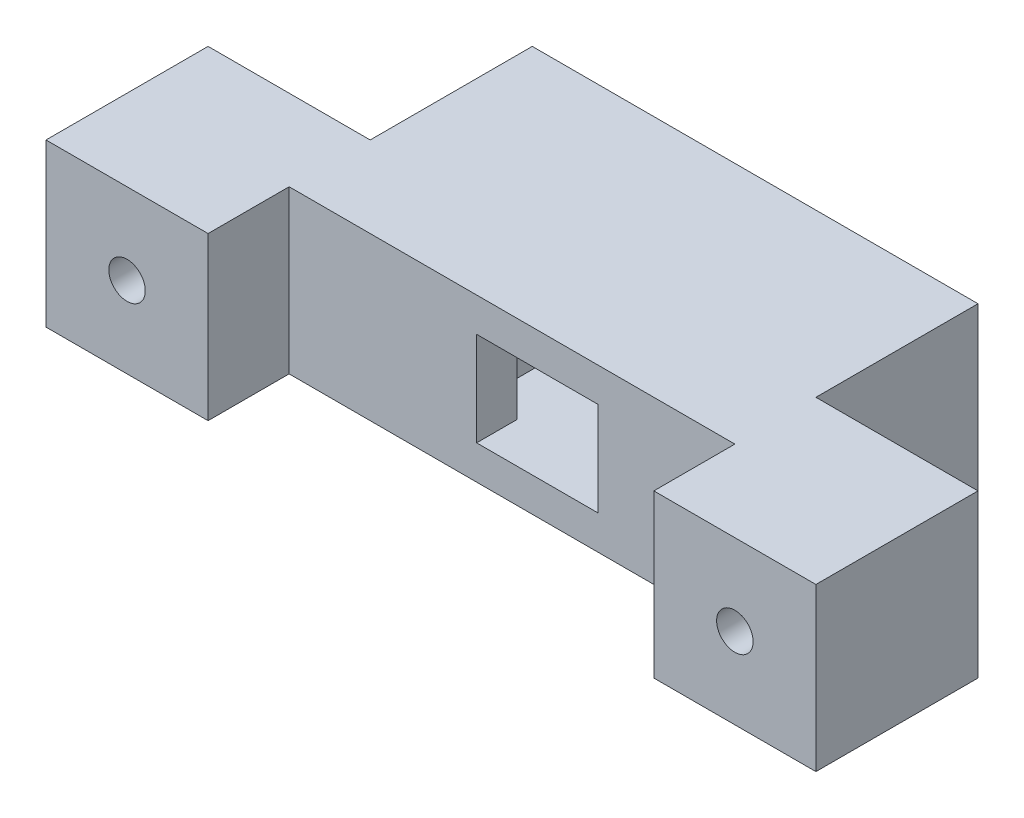
ISO-10303-21;
HEADER;
FILE_DESCRIPTION(('STEP AP214'),'2;1');
FILE_NAME('part.step','',(''),(''),'','','');
FILE_SCHEMA(('AUTOMOTIVE_DESIGN { 1 0 10303 214 1 1 1 1 }'));
ENDSEC;
DATA;
#1=APPLICATION_CONTEXT('core data for automotive mechanical design processes');
#2=APPLICATION_PROTOCOL_DEFINITION('international standard','automotive_design',2000,#1);
#3=PRODUCT_CONTEXT('',#1,'mechanical');
#4=PRODUCT('Part','Part','',(#3));
#5=PRODUCT_RELATED_PRODUCT_CATEGORY('part','',(#4));
#6=PRODUCT_DEFINITION_FORMATION('','',#4);
#7=PRODUCT_DEFINITION_CONTEXT('part definition',#1,'design');
#8=PRODUCT_DEFINITION('design','',#6,#7);
#9=PRODUCT_DEFINITION_SHAPE('','',#8);
#10=(LENGTH_UNIT() NAMED_UNIT(*) SI_UNIT(.MILLI.,.METRE.));
#11=(NAMED_UNIT(*) PLANE_ANGLE_UNIT() SI_UNIT($,.RADIAN.));
#12=(NAMED_UNIT(*) SI_UNIT($,.STERADIAN.) SOLID_ANGLE_UNIT());
#13=UNCERTAINTY_MEASURE_WITH_UNIT(LENGTH_MEASURE(1.E-05),#10,'distance_accuracy_value','');
#14=(GEOMETRIC_REPRESENTATION_CONTEXT(3) GLOBAL_UNCERTAINTY_ASSIGNED_CONTEXT((#13)) GLOBAL_UNIT_ASSIGNED_CONTEXT((#10,
#11,#12)) REPRESENTATION_CONTEXT('',''));
#15=CARTESIAN_POINT('',(0.,0.,0.));
#16=DIRECTION('',(0.,0.,1.));
#17=DIRECTION('',(1.,0.,0.));
#18=AXIS2_PLACEMENT_3D('',#15,#16,#17);
#19=CARTESIAN_POINT('',(51.865,15.8,40.96));
#20=DIRECTION('',(1.,0.,0.));
#21=DIRECTION('',(0.,0.,-1.));
#22=AXIS2_PLACEMENT_3D('',#19,#20,#21);
#23=PLANE('',#22);
#24=DIRECTION('',(0.,0.,-1.));
#25=VECTOR('',#24,1.);
#26=CARTESIAN_POINT('',(51.865,4.2,40.96));
#27=LINE('',#26,#25);
#28=CARTESIAN_POINT('',(51.865,4.2,40.96));
#29=VERTEX_POINT('',#28);
#30=CARTESIAN_POINT('',(51.865,4.2,40.));
#31=VERTEX_POINT('',#30);
#32=EDGE_CURVE('E207',#29,#31,#27,.T.);
#33=ORIENTED_EDGE('',*,*,#32,.F.);
#34=DIRECTION('',(0.,1.,0.));
#35=VECTOR('',#34,1.);
#36=CARTESIAN_POINT('',(51.865,0.,40.96));
#37=LINE('',#36,#35);
#38=CARTESIAN_POINT('',(51.865,15.8,40.96));
#39=VERTEX_POINT('',#38);
#40=EDGE_CURVE('E201',#39,#29,#37,.F.);
#41=ORIENTED_EDGE('',*,*,#40,.F.);
#42=DIRECTION('',(0.,0.,-1.));
#43=VECTOR('',#42,1.);
#44=CARTESIAN_POINT('',(51.865,15.8,40.96));
#45=LINE('',#44,#43);
#46=CARTESIAN_POINT('',(51.865,15.8,40.));
#47=VERTEX_POINT('',#46);
#48=EDGE_CURVE('E213',#47,#39,#45,.F.);
#49=ORIENTED_EDGE('',*,*,#48,.F.);
#50=DIRECTION('',(0.,1.,0.));
#51=VECTOR('',#50,1.);
#52=CARTESIAN_POINT('',(51.865,0.,40.));
#53=LINE('',#52,#51);
#54=EDGE_CURVE('E204',#31,#47,#53,.T.);
#55=ORIENTED_EDGE('',*,*,#54,.F.);
#56=EDGE_LOOP('',(#33,#41,#49,#55));
#57=FACE_BOUND('',#56,.T.);
#58=ADVANCED_FACE('F17',(#57),#23,.F.);
#59=CARTESIAN_POINT('',(0.,0.,40.));
#60=DIRECTION('',(0.,0.,-1.));
#61=DIRECTION('',(-1.,0.,0.));
#62=AXIS2_PLACEMENT_3D('',#59,#60,#61);
#63=PLANE('',#62);
#64=DIRECTION('',(0.,1.,0.));
#65=VECTOR('',#64,1.);
#66=CARTESIAN_POINT('',(56.265,15.8,40.));
#67=LINE('',#66,#65);
#68=CARTESIAN_POINT('',(56.265,15.8,40.));
#69=VERTEX_POINT('',#68);
#70=CARTESIAN_POINT('',(56.265,4.2,40.));
#71=VERTEX_POINT('',#70);
#72=EDGE_CURVE('E194',#69,#71,#67,.F.);
#73=ORIENTED_EDGE('',*,*,#72,.T.);
#74=DIRECTION('',(1.,0.,0.));
#75=VECTOR('',#74,1.);
#76=CARTESIAN_POINT('',(56.265,4.2,40.));
#77=LINE('',#76,#75);
#78=EDGE_CURVE('E259',#71,#31,#77,.F.);
#79=ORIENTED_EDGE('',*,*,#78,.T.);
#80=ORIENTED_EDGE('',*,*,#54,.T.);
#81=DIRECTION('',(1.,0.,0.));
#82=VECTOR('',#81,1.);
#83=CARTESIAN_POINT('',(56.265,15.8,40.));
#84=LINE('',#83,#82);
#85=EDGE_CURVE('E271',#47,#69,#84,.T.);
#86=ORIENTED_EDGE('',*,*,#85,.T.);
#87=EDGE_LOOP('',(#73,#79,#80,#86));
#88=FACE_BOUND('',#87,.T.);
#89=ADVANCED_FACE('F386',(#88),#63,.T.);
#90=CARTESIAN_POINT('',(0.,0.,40.96));
#91=DIRECTION('',(0.,0.,-1.));
#92=DIRECTION('',(-1.,0.,0.));
#93=AXIS2_PLACEMENT_3D('',#90,#91,#92);
#94=PLANE('',#93);
#95=ORIENTED_EDGE('',*,*,#40,.T.);
#96=DIRECTION('',(1.,0.,0.));
#97=VECTOR('',#96,1.);
#98=CARTESIAN_POINT('',(56.265,4.2,40.96));
#99=LINE('',#98,#97);
#100=CARTESIAN_POINT('',(43.135,4.2,40.96));
#101=VERTEX_POINT('',#100);
#102=EDGE_CURVE('E257',#29,#101,#99,.F.);
#103=ORIENTED_EDGE('',*,*,#102,.T.);
#104=DIRECTION('',(0.,1.,0.));
#105=VECTOR('',#104,1.);
#106=CARTESIAN_POINT('',(43.135,15.8,40.96));
#107=LINE('',#106,#105);
#108=CARTESIAN_POINT('',(43.135,15.8,40.96));
#109=VERTEX_POINT('',#108);
#110=EDGE_CURVE('E162',#101,#109,#107,.T.);
#111=ORIENTED_EDGE('',*,*,#110,.T.);
#112=DIRECTION('',(1.,0.,0.));
#113=VECTOR('',#112,1.);
#114=CARTESIAN_POINT('',(56.265,15.8,40.96));
#115=LINE('',#114,#113);
#116=EDGE_CURVE('E274',#109,#39,#115,.T.);
#117=ORIENTED_EDGE('',*,*,#116,.T.);
#118=EDGE_LOOP('',(#95,#103,#111,#117));
#119=FACE_BOUND('',#118,.T.);
#120=ADVANCED_FACE('F390',(#119),#94,.T.);
#121=CARTESIAN_POINT('',(0.,0.,40.));
#122=DIRECTION('',(0.,0.,-1.));
#123=DIRECTION('',(-1.,0.,0.));
#124=AXIS2_PLACEMENT_3D('',#121,#122,#123);
#125=PLANE('',#124);
#126=DIRECTION('',(0.,1.,0.));
#127=VECTOR('',#126,1.);
#128=CARTESIAN_POINT('',(23.735,15.8,40.));
#129=LINE('',#128,#127);
#130=CARTESIAN_POINT('',(23.735,4.2,40.));
#131=VERTEX_POINT('',#130);
#132=CARTESIAN_POINT('',(23.735,15.8,40.));
#133=VERTEX_POINT('',#132);
#134=EDGE_CURVE('E193',#131,#133,#129,.T.);
#135=ORIENTED_EDGE('',*,*,#134,.T.);
#136=DIRECTION('',(1.,0.,0.));
#137=VECTOR('',#136,1.);
#138=CARTESIAN_POINT('',(56.265,15.8,40.));
#139=LINE('',#138,#137);
#140=CARTESIAN_POINT('',(28.135,15.8,40.));
#141=VERTEX_POINT('',#140);
#142=EDGE_CURVE('E185',#133,#141,#139,.T.);
#143=ORIENTED_EDGE('',*,*,#142,.T.);
#144=DIRECTION('',(0.,1.,0.));
#145=VECTOR('',#144,1.);
#146=CARTESIAN_POINT('',(28.135,15.8,40.));
#147=LINE('',#146,#145);
#148=CARTESIAN_POINT('',(28.135,4.2,40.));
#149=VERTEX_POINT('',#148);
#150=EDGE_CURVE('E167',#141,#149,#147,.F.);
#151=ORIENTED_EDGE('',*,*,#150,.T.);
#152=DIRECTION('',(1.,0.,0.));
#153=VECTOR('',#152,1.);
#154=CARTESIAN_POINT('',(56.265,4.2,40.));
#155=LINE('',#154,#153);
#156=EDGE_CURVE('E251',#149,#131,#155,.F.);
#157=ORIENTED_EDGE('',*,*,#156,.T.);
#158=EDGE_LOOP('',(#135,#143,#151,#157));
#159=FACE_BOUND('',#158,.T.);
#160=ADVANCED_FACE('F192',(#159),#125,.T.);
#161=CARTESIAN_POINT('',(-5.,10.,35.000000000025));
#162=DIRECTION('',(0.,0.,-1.));
#163=DIRECTION('',(-1.,0.,0.));
#164=AXIS2_PLACEMENT_3D('',#161,#162,#163);
#165=CONICAL_SURFACE('',#164,4.70000000006621,0.785398163397448);
#166=CARTESIAN_POINT('',(-5.,10.,35.000000000025));
#167=DIRECTION('',(0.,0.,-1.));
#168=DIRECTION('',(-1.,0.,0.));
#169=AXIS2_PLACEMENT_3D('',#166,#167,#168);
#170=CIRCLE('',#169,4.70000000006621);
#171=CARTESIAN_POINT('',(-9.70000000006621,10.,35.000000000025));
#172=VERTEX_POINT('',#171);
#173=EDGE_CURVE('E20',#172,#172,#170,.F.);
#174=ORIENTED_EDGE('',*,*,#173,.F.);
#175=EDGE_LOOP('',(#174));
#176=FACE_BOUND('',#175,.T.);
#177=CARTESIAN_POINT('',(-5.,10.,37.45));
#178=DIRECTION('',(0.,0.,-1.));
#179=DIRECTION('',(-1.,0.,0.));
#180=AXIS2_PLACEMENT_3D('',#177,#178,#179);
#181=CIRCLE('',#180,2.25);
#182=CARTESIAN_POINT('',(-7.25,10.,37.45));
#183=VERTEX_POINT('',#182);
#184=EDGE_CURVE('E200',#183,#183,#181,.F.);
#185=ORIENTED_EDGE('',*,*,#184,.T.);
#186=EDGE_LOOP('',(#185));
#187=FACE_BOUND('',#186,.T.);
#188=ADVANCED_FACE('F398',(#176,#187),#165,.F.);
#189=CARTESIAN_POINT('',(-5.,10.,35.));
#190=DIRECTION('',(0.,0.,-1.));
#191=DIRECTION('',(-1.,0.,0.));
#192=AXIS2_PLACEMENT_3D('',#189,#190,#191);
#193=CYLINDRICAL_SURFACE('',#192,2.25);
#194=CARTESIAN_POINT('',(-5.,10.,55.));
#195=DIRECTION('',(0.,0.,-1.));
#196=DIRECTION('',(-1.,0.,0.));
#197=AXIS2_PLACEMENT_3D('',#194,#195,#196);
#198=CIRCLE('',#197,2.25);
#199=CARTESIAN_POINT('',(-7.25,10.,55.));
#200=VERTEX_POINT('',#199);
#201=EDGE_CURVE('E224',#200,#200,#198,.F.);
#202=ORIENTED_EDGE('',*,*,#201,.T.);
#203=EDGE_LOOP('',(#202));
#204=FACE_BOUND('',#203,.T.);
#205=ORIENTED_EDGE('',*,*,#184,.F.);
#206=EDGE_LOOP('',(#205));
#207=FACE_BOUND('',#206,.T.);
#208=ADVANCED_FACE('F470',(#204,#207),#193,.F.);
#209=CARTESIAN_POINT('',(43.135,15.8,45.));
#210=DIRECTION('',(1.,0.,0.));
#211=DIRECTION('',(0.,0.,-1.));
#212=AXIS2_PLACEMENT_3D('',#209,#210,#211);
#213=PLANE('',#212);
#214=DIRECTION('',(0.,0.,-1.));
#215=VECTOR('',#214,1.);
#216=CARTESIAN_POINT('',(43.135,4.2,40.));
#217=LINE('',#216,#215);
#218=CARTESIAN_POINT('',(43.135,4.2,45.));
#219=VERTEX_POINT('',#218);
#220=EDGE_CURVE('E254',#101,#219,#217,.F.);
#221=ORIENTED_EDGE('',*,*,#220,.T.);
#222=DIRECTION('',(0.,1.,0.));
#223=VECTOR('',#222,1.);
#224=CARTESIAN_POINT('',(43.135,0.,45.));
#225=LINE('',#224,#223);
#226=CARTESIAN_POINT('',(43.135,15.8,45.));
#227=VERTEX_POINT('',#226);
#228=EDGE_CURVE('E280',#219,#227,#225,.T.);
#229=ORIENTED_EDGE('',*,*,#228,.T.);
#230=DIRECTION('',(0.,0.,1.));
#231=VECTOR('',#230,1.);
#232=CARTESIAN_POINT('',(43.135,15.8,40.));
#233=LINE('',#232,#231);
#234=EDGE_CURVE('E189',#227,#109,#233,.F.);
#235=ORIENTED_EDGE('',*,*,#234,.T.);
#236=ORIENTED_EDGE('',*,*,#110,.F.);
#237=EDGE_LOOP('',(#221,#229,#235,#236));
#238=FACE_BOUND('',#237,.T.);
#239=ADVANCED_FACE('F278',(#238),#213,.F.);
#240=CARTESIAN_POINT('',(28.135,15.8,45.));
#241=DIRECTION('',(-1.,0.,0.));
#242=DIRECTION('',(0.,0.,1.));
#243=AXIS2_PLACEMENT_3D('',#240,#241,#242);
#244=PLANE('',#243);
#245=DIRECTION('',(0.,0.,1.));
#246=VECTOR('',#245,1.);
#247=CARTESIAN_POINT('',(28.135,15.8,40.));
#248=LINE('',#247,#246);
#249=CARTESIAN_POINT('',(28.135,15.8,45.));
#250=VERTEX_POINT('',#249);
#251=EDGE_CURVE('E171',#141,#250,#248,.T.);
#252=ORIENTED_EDGE('',*,*,#251,.T.);
#253=DIRECTION('',(0.,1.,0.));
#254=VECTOR('',#253,1.);
#255=CARTESIAN_POINT('',(28.135,0.,45.));
#256=LINE('',#255,#254);
#257=CARTESIAN_POINT('',(28.135,4.2,45.));
#258=VERTEX_POINT('',#257);
#259=EDGE_CURVE('E284',#250,#258,#256,.F.);
#260=ORIENTED_EDGE('',*,*,#259,.T.);
#261=DIRECTION('',(0.,0.,-1.));
#262=VECTOR('',#261,1.);
#263=CARTESIAN_POINT('',(28.135,4.2,40.));
#264=LINE('',#263,#262);
#265=EDGE_CURVE('E173',#258,#149,#264,.T.);
#266=ORIENTED_EDGE('',*,*,#265,.T.);
#267=ORIENTED_EDGE('',*,*,#150,.F.);
#268=EDGE_LOOP('',(#252,#260,#266,#267));
#269=FACE_BOUND('',#268,.T.);
#270=ADVANCED_FACE('F169',(#269),#244,.F.);
#271=CARTESIAN_POINT('',(70.,10.,35.));
#272=DIRECTION('',(0.,0.,-1.));
#273=DIRECTION('',(-1.,0.,0.));
#274=AXIS2_PLACEMENT_3D('',#271,#272,#273);
#275=CYLINDRICAL_SURFACE('',#274,2.25);
#276=CARTESIAN_POINT('',(70.,10.,55.));
#277=DIRECTION('',(0.,0.,-1.));
#278=DIRECTION('',(-1.,0.,0.));
#279=AXIS2_PLACEMENT_3D('',#276,#277,#278);
#280=CIRCLE('',#279,2.25);
#281=CARTESIAN_POINT('',(67.75,10.,55.));
#282=VERTEX_POINT('',#281);
#283=EDGE_CURVE('E220',#282,#282,#280,.T.);
#284=ORIENTED_EDGE('',*,*,#283,.F.);
#285=EDGE_LOOP('',(#284));
#286=FACE_BOUND('',#285,.T.);
#287=CARTESIAN_POINT('',(70.,10.,37.4500000000353));
#288=DIRECTION('',(0.,0.,-1.));
#289=DIRECTION('',(-1.,0.,0.));
#290=AXIS2_PLACEMENT_3D('',#287,#288,#289);
#291=CIRCLE('',#290,2.25000000001047);
#292=CARTESIAN_POINT('',(67.7499999999895,10.,37.4500000000353));
#293=VERTEX_POINT('',#292);
#294=EDGE_CURVE('E178',#293,#293,#291,.T.);
#295=ORIENTED_EDGE('',*,*,#294,.T.);
#296=EDGE_LOOP('',(#295));
#297=FACE_BOUND('',#296,.T.);
#298=ADVANCED_FACE('F461',(#286,#297),#275,.F.);
#299=CARTESIAN_POINT('',(70.,10.,35.000000000025));
#300=DIRECTION('',(0.,0.,-1.));
#301=DIRECTION('',(-1.,0.,0.));
#302=AXIS2_PLACEMENT_3D('',#299,#300,#301);
#303=CONICAL_SURFACE('',#302,4.70000000007759,0.785398163409049);
#304=ORIENTED_EDGE('',*,*,#294,.F.);
#305=EDGE_LOOP('',(#304));
#306=FACE_BOUND('',#305,.T.);
#307=CARTESIAN_POINT('',(70.,10.,35.0000000000318));
#308=DIRECTION('',(0.,0.,-1.));
#309=DIRECTION('',(-1.,0.,0.));
#310=AXIS2_PLACEMENT_3D('',#307,#308,#309);
#311=CIRCLE('',#310,4.70000000007076);
#312=CARTESIAN_POINT('',(65.2999999999292,10.,35.0000000000318));
#313=VERTEX_POINT('',#312);
#314=EDGE_CURVE('E215',#313,#313,#311,.T.);
#315=ORIENTED_EDGE('',*,*,#314,.T.);
#316=EDGE_LOOP('',(#315));
#317=FACE_BOUND('',#316,.T.);
#318=ADVANCED_FACE('F458',(#306,#317),#303,.F.);
#319=CARTESIAN_POINT('',(56.265,15.8,40.));
#320=DIRECTION('',(1.,0.,0.));
#321=DIRECTION('',(0.,0.,-1.));
#322=AXIS2_PLACEMENT_3D('',#319,#320,#321);
#323=PLANE('',#322);
#324=DIRECTION('',(0.,0.,-1.));
#325=VECTOR('',#324,1.);
#326=CARTESIAN_POINT('',(56.265,4.2,40.));
#327=LINE('',#326,#325);
#328=CARTESIAN_POINT('',(56.265,4.2,15.));
#329=VERTEX_POINT('',#328);
#330=EDGE_CURVE('E262',#329,#71,#327,.F.);
#331=ORIENTED_EDGE('',*,*,#330,.T.);
#332=ORIENTED_EDGE('',*,*,#72,.F.);
#333=DIRECTION('',(0.,0.,1.));
#334=VECTOR('',#333,1.);
#335=CARTESIAN_POINT('',(56.265,15.8,40.));
#336=LINE('',#335,#334);
#337=CARTESIAN_POINT('',(56.265,15.8,15.));
#338=VERTEX_POINT('',#337);
#339=EDGE_CURVE('E268',#69,#338,#336,.F.);
#340=ORIENTED_EDGE('',*,*,#339,.T.);
#341=DIRECTION('',(0.,1.,0.));
#342=VECTOR('',#341,1.);
#343=CARTESIAN_POINT('',(56.265,0.,15.));
#344=LINE('',#343,#342);
#345=EDGE_CURVE('E339',#329,#338,#344,.T.);
#346=ORIENTED_EDGE('',*,*,#345,.F.);
#347=EDGE_LOOP('',(#331,#332,#340,#346));
#348=FACE_BOUND('',#347,.T.);
#349=ADVANCED_FACE('F383',(#348),#323,.F.);
#350=CARTESIAN_POINT('',(56.265,15.8,40.));
#351=DIRECTION('',(0.,1.,0.));
#352=DIRECTION('',(0.,0.,1.));
#353=AXIS2_PLACEMENT_3D('',#350,#351,#352);
#354=PLANE('',#353);
#355=ORIENTED_EDGE('',*,*,#339,.F.);
#356=ORIENTED_EDGE('',*,*,#85,.F.);
#357=ORIENTED_EDGE('',*,*,#48,.T.);
#358=ORIENTED_EDGE('',*,*,#116,.F.);
#359=ORIENTED_EDGE('',*,*,#234,.F.);
#360=DIRECTION('',(-1.,0.,0.));
#361=VECTOR('',#360,1.);
#362=CARTESIAN_POINT('',(0.,15.8,45.));
#363=LINE('',#362,#361);
#364=EDGE_CURVE('E188',#227,#250,#363,.T.);
#365=ORIENTED_EDGE('',*,*,#364,.T.);
#366=ORIENTED_EDGE('',*,*,#251,.F.);
#367=ORIENTED_EDGE('',*,*,#142,.F.);
#368=DIRECTION('',(0.,0.,1.));
#369=VECTOR('',#368,1.);
#370=CARTESIAN_POINT('',(23.735,15.8,40.));
#371=LINE('',#370,#369);
#372=CARTESIAN_POINT('',(23.735,15.8,15.));
#373=VERTEX_POINT('',#372);
#374=EDGE_CURVE('E265',#133,#373,#371,.F.);
#375=ORIENTED_EDGE('',*,*,#374,.T.);
#376=DIRECTION('',(-1.,0.,0.));
#377=VECTOR('',#376,1.);
#378=CARTESIAN_POINT('',(0.,15.8,15.));
#379=LINE('',#378,#377);
#380=EDGE_CURVE('E337',#338,#373,#379,.T.);
#381=ORIENTED_EDGE('',*,*,#380,.F.);
#382=EDGE_LOOP('',(#355,#356,#357,#358,#359,#365,#366,#367,#375,#381));
#383=FACE_BOUND('',#382,.T.);
#384=ADVANCED_FACE('F183',(#383),#354,.F.);
#385=CARTESIAN_POINT('',(23.735,15.8,40.));
#386=DIRECTION('',(-1.,0.,0.));
#387=DIRECTION('',(0.,0.,1.));
#388=AXIS2_PLACEMENT_3D('',#385,#386,#387);
#389=PLANE('',#388);
#390=ORIENTED_EDGE('',*,*,#374,.F.);
#391=ORIENTED_EDGE('',*,*,#134,.F.);
#392=DIRECTION('',(0.,0.,-1.));
#393=VECTOR('',#392,1.);
#394=CARTESIAN_POINT('',(23.735,4.2,40.));
#395=LINE('',#394,#393);
#396=CARTESIAN_POINT('',(23.735,4.2,15.));
#397=VERTEX_POINT('',#396);
#398=EDGE_CURVE('E248',#131,#397,#395,.T.);
#399=ORIENTED_EDGE('',*,*,#398,.T.);
#400=DIRECTION('',(0.,1.,0.));
#401=VECTOR('',#400,1.);
#402=CARTESIAN_POINT('',(23.735,0.,15.));
#403=LINE('',#402,#401);
#404=EDGE_CURVE('E335',#373,#397,#403,.F.);
#405=ORIENTED_EDGE('',*,*,#404,.F.);
#406=EDGE_LOOP('',(#390,#391,#399,#405));
#407=FACE_BOUND('',#406,.T.);
#408=ADVANCED_FACE('F376',(#407),#389,.F.);
#409=CARTESIAN_POINT('',(56.265,4.2,40.));
#410=DIRECTION('',(0.,-1.,0.));
#411=DIRECTION('',(0.,0.,-1.));
#412=AXIS2_PLACEMENT_3D('',#409,#410,#411);
#413=PLANE('',#412);
#414=ORIENTED_EDGE('',*,*,#398,.F.);
#415=ORIENTED_EDGE('',*,*,#156,.F.);
#416=ORIENTED_EDGE('',*,*,#265,.F.);
#417=DIRECTION('',(-1.,0.,0.));
#418=VECTOR('',#417,1.);
#419=CARTESIAN_POINT('',(0.,4.2,45.));
#420=LINE('',#419,#418);
#421=EDGE_CURVE('E286',#258,#219,#420,.F.);
#422=ORIENTED_EDGE('',*,*,#421,.T.);
#423=ORIENTED_EDGE('',*,*,#220,.F.);
#424=ORIENTED_EDGE('',*,*,#102,.F.);
#425=ORIENTED_EDGE('',*,*,#32,.T.);
#426=ORIENTED_EDGE('',*,*,#78,.F.);
#427=ORIENTED_EDGE('',*,*,#330,.F.);
#428=DIRECTION('',(-1.,0.,0.));
#429=VECTOR('',#428,1.);
#430=CARTESIAN_POINT('',(0.,4.2,15.));
#431=LINE('',#430,#429);
#432=EDGE_CURVE('E332',#397,#329,#431,.F.);
#433=ORIENTED_EDGE('',*,*,#432,.F.);
#434=EDGE_LOOP('',(#414,#415,#416,#422,#423,#424,#425,#426,#427,#433));
#435=FACE_BOUND('',#434,.T.);
#436=ADVANCED_FACE('F371',(#435),#413,.F.);
#437=CARTESIAN_POINT('',(0.,20.,45.));
#438=DIRECTION('',(0.,-1.,0.));
#439=DIRECTION('',(0.,0.,-1.));
#440=AXIS2_PLACEMENT_3D('',#437,#438,#439);
#441=PLANE('',#440);
#442=DIRECTION('',(0.,0.,-1.));
#443=VECTOR('',#442,1.);
#444=CARTESIAN_POINT('',(5.,20.,35.));
#445=LINE('',#444,#443);
#446=CARTESIAN_POINT('',(5.,20.,15.));
#447=VERTEX_POINT('',#446);
#448=CARTESIAN_POINT('',(5.,20.,35.));
#449=VERTEX_POINT('',#448);
#450=EDGE_CURVE('E245',#447,#449,#445,.F.);
#451=ORIENTED_EDGE('',*,*,#450,.T.);
#452=DIRECTION('',(-1.,0.,0.));
#453=VECTOR('',#452,1.);
#454=CARTESIAN_POINT('',(0.,20.,35.));
#455=LINE('',#454,#453);
#456=CARTESIAN_POINT('',(-15.,20.,35.));
#457=VERTEX_POINT('',#456);
#458=EDGE_CURVE('E243',#457,#449,#455,.F.);
#459=ORIENTED_EDGE('',*,*,#458,.F.);
#460=DIRECTION('',(0.,0.,1.));
#461=VECTOR('',#460,1.);
#462=CARTESIAN_POINT('',(-15.,20.,0.));
#463=LINE('',#462,#461);
#464=CARTESIAN_POINT('',(-15.,20.,55.));
#465=VERTEX_POINT('',#464);
#466=EDGE_CURVE('E232',#465,#457,#463,.F.);
#467=ORIENTED_EDGE('',*,*,#466,.F.);
#468=DIRECTION('',(-1.,0.,0.));
#469=VECTOR('',#468,1.);
#470=CARTESIAN_POINT('',(0.,20.,55.));
#471=LINE('',#470,#469);
#472=CARTESIAN_POINT('',(5.,20.,55.));
#473=VERTEX_POINT('',#472);
#474=EDGE_CURVE('E226',#465,#473,#471,.F.);
#475=ORIENTED_EDGE('',*,*,#474,.T.);
#476=DIRECTION('',(0.,0.,1.));
#477=VECTOR('',#476,1.);
#478=CARTESIAN_POINT('',(5.,20.,55.));
#479=LINE('',#478,#477);
#480=CARTESIAN_POINT('',(5.,20.,45.));
#481=VERTEX_POINT('',#480);
#482=EDGE_CURVE('E288',#473,#481,#479,.F.);
#483=ORIENTED_EDGE('',*,*,#482,.T.);
#484=DIRECTION('',(-1.,0.,0.));
#485=VECTOR('',#484,1.);
#486=CARTESIAN_POINT('',(0.,20.,45.));
#487=LINE('',#486,#485);
#488=CARTESIAN_POINT('',(60.,20.,45.));
#489=VERTEX_POINT('',#488);
#490=EDGE_CURVE('E363',#481,#489,#487,.F.);
#491=ORIENTED_EDGE('',*,*,#490,.T.);
#492=DIRECTION('',(0.,0.,-1.));
#493=VECTOR('',#492,1.);
#494=CARTESIAN_POINT('',(60.,20.,55.));
#495=LINE('',#494,#493);
#496=CARTESIAN_POINT('',(60.,20.,55.));
#497=VERTEX_POINT('',#496);
#498=EDGE_CURVE('E360',#489,#497,#495,.F.);
#499=ORIENTED_EDGE('',*,*,#498,.T.);
#500=DIRECTION('',(1.,0.,0.));
#501=VECTOR('',#500,1.);
#502=CARTESIAN_POINT('',(0.,20.,55.));
#503=LINE('',#502,#501);
#504=CARTESIAN_POINT('',(80.,20.,55.));
#505=VERTEX_POINT('',#504);
#506=EDGE_CURVE('E222',#505,#497,#503,.F.);
#507=ORIENTED_EDGE('',*,*,#506,.F.);
#508=DIRECTION('',(0.,0.,1.));
#509=VECTOR('',#508,1.);
#510=CARTESIAN_POINT('',(80.,20.,45.));
#511=LINE('',#510,#509);
#512=CARTESIAN_POINT('',(80.,20.,35.));
#513=VERTEX_POINT('',#512);
#514=EDGE_CURVE('E219',#505,#513,#511,.F.);
#515=ORIENTED_EDGE('',*,*,#514,.T.);
#516=DIRECTION('',(1.,0.,0.));
#517=VECTOR('',#516,1.);
#518=CARTESIAN_POINT('',(0.,20.,35.));
#519=LINE('',#518,#517);
#520=CARTESIAN_POINT('',(60.,20.,35.));
#521=VERTEX_POINT('',#520);
#522=EDGE_CURVE('E347',#513,#521,#519,.F.);
#523=ORIENTED_EDGE('',*,*,#522,.T.);
#524=DIRECTION('',(0.,0.,1.));
#525=VECTOR('',#524,1.);
#526=CARTESIAN_POINT('',(60.,20.,35.));
#527=LINE('',#526,#525);
#528=CARTESIAN_POINT('',(60.,20.,15.));
#529=VERTEX_POINT('',#528);
#530=EDGE_CURVE('E341',#521,#529,#527,.F.);
#531=ORIENTED_EDGE('',*,*,#530,.T.);
#532=DIRECTION('',(-1.,0.,0.));
#533=VECTOR('',#532,1.);
#534=CARTESIAN_POINT('',(0.,20.,15.));
#535=LINE('',#534,#533);
#536=EDGE_CURVE('E327',#447,#529,#535,.F.);
#537=ORIENTED_EDGE('',*,*,#536,.F.);
#538=EDGE_LOOP('',(#451,#459,#467,#475,#483,#491,#499,#507,#515,#523,#531,#537));
#539=FACE_BOUND('',#538,.T.);
#540=ADVANCED_FACE('F445',(#539),#441,.F.);
#541=CARTESIAN_POINT('',(5.,20.,35.));
#542=DIRECTION('',(1.,0.,0.));
#543=DIRECTION('',(0.,0.,-1.));
#544=AXIS2_PLACEMENT_3D('',#541,#542,#543);
#545=PLANE('',#544);
#546=DIRECTION('',(0.,0.,1.));
#547=VECTOR('',#546,1.);
#548=CARTESIAN_POINT('',(5.,0.,45.));
#549=LINE('',#548,#547);
#550=CARTESIAN_POINT('',(5.,0.,15.));
#551=VERTEX_POINT('',#550);
#552=CARTESIAN_POINT('',(5.,0.,35.));
#553=VERTEX_POINT('',#552);
#554=EDGE_CURVE('E323',#551,#553,#549,.T.);
#555=ORIENTED_EDGE('',*,*,#554,.T.);
#556=DIRECTION('',(0.,1.,0.));
#557=VECTOR('',#556,1.);
#558=CARTESIAN_POINT('',(5.,0.,35.));
#559=LINE('',#558,#557);
#560=EDGE_CURVE('E238',#449,#553,#559,.F.);
#561=ORIENTED_EDGE('',*,*,#560,.F.);
#562=ORIENTED_EDGE('',*,*,#450,.F.);
#563=DIRECTION('',(0.,1.,0.));
#564=VECTOR('',#563,1.);
#565=CARTESIAN_POINT('',(5.,0.,15.));
#566=LINE('',#565,#564);
#567=EDGE_CURVE('E329',#551,#447,#566,.T.);
#568=ORIENTED_EDGE('',*,*,#567,.F.);
#569=EDGE_LOOP('',(#555,#561,#562,#568));
#570=FACE_BOUND('',#569,.T.);
#571=ADVANCED_FACE('F441',(#570),#545,.F.);
#572=CARTESIAN_POINT('',(0.,0.,35.));
#573=DIRECTION('',(0.,0.,-1.));
#574=DIRECTION('',(-1.,0.,0.));
#575=AXIS2_PLACEMENT_3D('',#572,#573,#574);
#576=PLANE('',#575);
#577=ORIENTED_EDGE('',*,*,#458,.T.);
#578=ORIENTED_EDGE('',*,*,#560,.T.);
#579=DIRECTION('',(1.,0.,0.));
#580=VECTOR('',#579,1.);
#581=CARTESIAN_POINT('',(0.,0.,35.));
#582=LINE('',#581,#580);
#583=CARTESIAN_POINT('',(-15.,0.,35.));
#584=VERTEX_POINT('',#583);
#585=EDGE_CURVE('E318',#553,#584,#582,.F.);
#586=ORIENTED_EDGE('',*,*,#585,.T.);
#587=DIRECTION('',(0.,1.,0.));
#588=VECTOR('',#587,1.);
#589=CARTESIAN_POINT('',(-15.,0.,35.));
#590=LINE('',#589,#588);
#591=EDGE_CURVE('E227',#457,#584,#590,.F.);
#592=ORIENTED_EDGE('',*,*,#591,.F.);
#593=EDGE_LOOP('',(#577,#578,#586,#592));
#594=FACE_BOUND('',#593,.T.);
#595=ORIENTED_EDGE('',*,*,#173,.T.);
#596=EDGE_LOOP('',(#595));
#597=FACE_BOUND('',#596,.T.);
#598=ADVANCED_FACE('F438',(#594,#597),#576,.T.);
#599=CARTESIAN_POINT('',(-15.,0.,0.));
#600=DIRECTION('',(-1.,0.,0.));
#601=DIRECTION('',(0.,0.,1.));
#602=AXIS2_PLACEMENT_3D('',#599,#600,#601);
#603=PLANE('',#602);
#604=DIRECTION('',(0.,0.,1.));
#605=VECTOR('',#604,1.);
#606=CARTESIAN_POINT('',(-15.,0.,45.));
#607=LINE('',#606,#605);
#608=CARTESIAN_POINT('',(-15.,0.,55.));
#609=VERTEX_POINT('',#608);
#610=EDGE_CURVE('E299',#584,#609,#607,.T.);
#611=ORIENTED_EDGE('',*,*,#610,.T.);
#612=DIRECTION('',(0.,1.,0.));
#613=VECTOR('',#612,1.);
#614=CARTESIAN_POINT('',(-15.,0.,55.));
#615=LINE('',#614,#613);
#616=EDGE_CURVE('E230',#609,#465,#615,.T.);
#617=ORIENTED_EDGE('',*,*,#616,.T.);
#618=ORIENTED_EDGE('',*,*,#466,.T.);
#619=ORIENTED_EDGE('',*,*,#591,.T.);
#620=EDGE_LOOP('',(#611,#617,#618,#619));
#621=FACE_BOUND('',#620,.T.);
#622=ADVANCED_FACE('F296',(#621),#603,.T.);
#623=CARTESIAN_POINT('',(0.,0.,55.));
#624=DIRECTION('',(0.,0.,-1.));
#625=DIRECTION('',(-1.,0.,0.));
#626=AXIS2_PLACEMENT_3D('',#623,#624,#625);
#627=PLANE('',#626);
#628=DIRECTION('',(1.,0.,0.));
#629=VECTOR('',#628,1.);
#630=CARTESIAN_POINT('',(0.,0.,55.));
#631=LINE('',#630,#629);
#632=CARTESIAN_POINT('',(5.,0.,55.));
#633=VERTEX_POINT('',#632);
#634=EDGE_CURVE('E305',#609,#633,#631,.T.);
#635=ORIENTED_EDGE('',*,*,#634,.T.);
#636=DIRECTION('',(0.,-1.,0.));
#637=VECTOR('',#636,1.);
#638=CARTESIAN_POINT('',(5.,20.,55.));
#639=LINE('',#638,#637);
#640=EDGE_CURVE('E293',#633,#473,#639,.F.);
#641=ORIENTED_EDGE('',*,*,#640,.T.);
#642=ORIENTED_EDGE('',*,*,#474,.F.);
#643=ORIENTED_EDGE('',*,*,#616,.F.);
#644=EDGE_LOOP('',(#635,#641,#642,#643));
#645=FACE_BOUND('',#644,.T.);
#646=ORIENTED_EDGE('',*,*,#201,.F.);
#647=EDGE_LOOP('',(#646));
#648=FACE_BOUND('',#647,.T.);
#649=ADVANCED_FACE('F303',(#645,#648),#627,.F.);
#650=CARTESIAN_POINT('',(5.,20.,55.));
#651=DIRECTION('',(-1.,0.,0.));
#652=DIRECTION('',(0.,-1.,0.));
#653=AXIS2_PLACEMENT_3D('',#650,#651,#652);
#654=PLANE('',#653);
#655=ORIENTED_EDGE('',*,*,#482,.F.);
#656=ORIENTED_EDGE('',*,*,#640,.F.);
#657=DIRECTION('',(0.,0.,1.));
#658=VECTOR('',#657,1.);
#659=CARTESIAN_POINT('',(5.,0.,45.));
#660=LINE('',#659,#658);
#661=CARTESIAN_POINT('',(5.,0.,45.));
#662=VERTEX_POINT('',#661);
#663=EDGE_CURVE('E314',#633,#662,#660,.F.);
#664=ORIENTED_EDGE('',*,*,#663,.T.);
#665=DIRECTION('',(0.,1.,0.));
#666=VECTOR('',#665,1.);
#667=CARTESIAN_POINT('',(5.,0.,45.));
#668=LINE('',#667,#666);
#669=EDGE_CURVE('E366',#662,#481,#668,.T.);
#670=ORIENTED_EDGE('',*,*,#669,.T.);
#671=EDGE_LOOP('',(#655,#656,#664,#670));
#672=FACE_BOUND('',#671,.T.);
#673=ADVANCED_FACE('F429',(#672),#654,.F.);
#674=CARTESIAN_POINT('',(0.,0.,45.));
#675=DIRECTION('',(0.,0.,-1.));
#676=DIRECTION('',(-1.,0.,0.));
#677=AXIS2_PLACEMENT_3D('',#674,#675,#676);
#678=PLANE('',#677);
#679=ORIENTED_EDGE('',*,*,#490,.F.);
#680=ORIENTED_EDGE('',*,*,#669,.F.);
#681=DIRECTION('',(1.,0.,0.));
#682=VECTOR('',#681,1.);
#683=CARTESIAN_POINT('',(0.,0.,45.));
#684=LINE('',#683,#682);
#685=CARTESIAN_POINT('',(60.,0.,45.));
#686=VERTEX_POINT('',#685);
#687=EDGE_CURVE('E316',#662,#686,#684,.T.);
#688=ORIENTED_EDGE('',*,*,#687,.T.);
#689=DIRECTION('',(0.,1.,0.));
#690=VECTOR('',#689,1.);
#691=CARTESIAN_POINT('',(60.,20.,45.));
#692=LINE('',#691,#690);
#693=EDGE_CURVE('E223',#686,#489,#692,.T.);
#694=ORIENTED_EDGE('',*,*,#693,.T.);
#695=EDGE_LOOP('',(#679,#680,#688,#694));
#696=FACE_BOUND('',#695,.T.);
#697=ORIENTED_EDGE('',*,*,#259,.F.);
#698=ORIENTED_EDGE('',*,*,#364,.F.);
#699=ORIENTED_EDGE('',*,*,#228,.F.);
#700=ORIENTED_EDGE('',*,*,#421,.F.);
#701=EDGE_LOOP('',(#697,#698,#699,#700));
#702=FACE_BOUND('',#701,.T.);
#703=ADVANCED_FACE('F282',(#696,#702),#678,.F.);
#704=CARTESIAN_POINT('',(60.,20.,55.));
#705=DIRECTION('',(1.,0.,0.));
#706=DIRECTION('',(0.,0.,-1.));
#707=AXIS2_PLACEMENT_3D('',#704,#705,#706);
#708=PLANE('',#707);
#709=DIRECTION('',(0.,0.,1.));
#710=VECTOR('',#709,1.);
#711=CARTESIAN_POINT('',(60.,0.,45.));
#712=LINE('',#711,#710);
#713=CARTESIAN_POINT('',(60.,0.,55.));
#714=VERTEX_POINT('',#713);
#715=EDGE_CURVE('E678',#686,#714,#712,.T.);
#716=ORIENTED_EDGE('',*,*,#715,.T.);
#717=DIRECTION('',(0.,1.,0.));
#718=VECTOR('',#717,1.);
#719=CARTESIAN_POINT('',(60.,0.,55.));
#720=LINE('',#719,#718);
#721=EDGE_CURVE('E355',#497,#714,#720,.F.);
#722=ORIENTED_EDGE('',*,*,#721,.F.);
#723=ORIENTED_EDGE('',*,*,#498,.F.);
#724=ORIENTED_EDGE('',*,*,#693,.F.);
#725=EDGE_LOOP('',(#716,#722,#723,#724));
#726=FACE_BOUND('',#725,.T.);
#727=ADVANCED_FACE('F422',(#726),#708,.F.);
#728=CARTESIAN_POINT('',(0.,0.,55.));
#729=DIRECTION('',(0.,0.,1.));
#730=DIRECTION('',(1.,0.,0.));
#731=AXIS2_PLACEMENT_3D('',#728,#729,#730);
#732=PLANE('',#731);
#733=ORIENTED_EDGE('',*,*,#721,.T.);
#734=DIRECTION('',(1.,0.,0.));
#735=VECTOR('',#734,1.);
#736=CARTESIAN_POINT('',(0.,0.,55.));
#737=LINE('',#736,#735);
#738=CARTESIAN_POINT('',(80.,0.,55.));
#739=VERTEX_POINT('',#738);
#740=EDGE_CURVE('E675',#714,#739,#737,.T.);
#741=ORIENTED_EDGE('',*,*,#740,.T.);
#742=DIRECTION('',(0.,1.,0.));
#743=VECTOR('',#742,1.);
#744=CARTESIAN_POINT('',(80.,0.,55.));
#745=LINE('',#744,#743);
#746=EDGE_CURVE('E352',#739,#505,#745,.T.);
#747=ORIENTED_EDGE('',*,*,#746,.T.);
#748=ORIENTED_EDGE('',*,*,#506,.T.);
#749=EDGE_LOOP('',(#733,#741,#747,#748));
#750=FACE_BOUND('',#749,.T.);
#751=ORIENTED_EDGE('',*,*,#283,.T.);
#752=EDGE_LOOP('',(#751));
#753=FACE_BOUND('',#752,.T.);
#754=ADVANCED_FACE('F418',(#750,#753),#732,.T.);
#755=CARTESIAN_POINT('',(80.,0.,45.));
#756=DIRECTION('',(-1.,0.,0.));
#757=DIRECTION('',(0.,0.,1.));
#758=AXIS2_PLACEMENT_3D('',#755,#756,#757);
#759=PLANE('',#758);
#760=DIRECTION('',(0.,1.,0.));
#761=VECTOR('',#760,1.);
#762=CARTESIAN_POINT('',(80.,0.,35.));
#763=LINE('',#762,#761);
#764=CARTESIAN_POINT('',(80.,0.,35.));
#765=VERTEX_POINT('',#764);
#766=EDGE_CURVE('E218',#765,#513,#763,.T.);
#767=ORIENTED_EDGE('',*,*,#766,.T.);
#768=ORIENTED_EDGE('',*,*,#514,.F.);
#769=ORIENTED_EDGE('',*,*,#746,.F.);
#770=DIRECTION('',(0.,0.,1.));
#771=VECTOR('',#770,1.);
#772=CARTESIAN_POINT('',(80.,0.,45.));
#773=LINE('',#772,#771);
#774=EDGE_CURVE('E670',#739,#765,#773,.F.);
#775=ORIENTED_EDGE('',*,*,#774,.T.);
#776=EDGE_LOOP('',(#767,#768,#769,#775));
#777=FACE_BOUND('',#776,.T.);
#778=ADVANCED_FACE('F414',(#777),#759,.F.);
#779=CARTESIAN_POINT('',(0.,0.,35.));
#780=DIRECTION('',(0.,0.,1.));
#781=DIRECTION('',(1.,0.,0.));
#782=AXIS2_PLACEMENT_3D('',#779,#780,#781);
#783=PLANE('',#782);
#784=DIRECTION('',(0.,1.,0.));
#785=VECTOR('',#784,1.);
#786=CARTESIAN_POINT('',(60.,20.,35.));
#787=LINE('',#786,#785);
#788=CARTESIAN_POINT('',(60.,0.,35.));
#789=VERTEX_POINT('',#788);
#790=EDGE_CURVE('E344',#789,#521,#787,.T.);
#791=ORIENTED_EDGE('',*,*,#790,.T.);
#792=ORIENTED_EDGE('',*,*,#522,.F.);
#793=ORIENTED_EDGE('',*,*,#766,.F.);
#794=DIRECTION('',(1.,0.,0.));
#795=VECTOR('',#794,1.);
#796=CARTESIAN_POINT('',(0.,0.,35.));
#797=LINE('',#796,#795);
#798=EDGE_CURVE('E668',#765,#789,#797,.F.);
#799=ORIENTED_EDGE('',*,*,#798,.T.);
#800=EDGE_LOOP('',(#791,#792,#793,#799));
#801=FACE_BOUND('',#800,.T.);
#802=ORIENTED_EDGE('',*,*,#314,.F.);
#803=EDGE_LOOP('',(#802));
#804=FACE_BOUND('',#803,.T.);
#805=ADVANCED_FACE('F410',(#801,#804),#783,.F.);
#806=CARTESIAN_POINT('',(60.,20.,35.));
#807=DIRECTION('',(-1.,0.,0.));
#808=DIRECTION('',(0.,0.,1.));
#809=AXIS2_PLACEMENT_3D('',#806,#807,#808);
#810=PLANE('',#809);
#811=ORIENTED_EDGE('',*,*,#530,.F.);
#812=ORIENTED_EDGE('',*,*,#790,.F.);
#813=DIRECTION('',(0.,0.,1.));
#814=VECTOR('',#813,1.);
#815=CARTESIAN_POINT('',(60.,0.,45.));
#816=LINE('',#815,#814);
#817=CARTESIAN_POINT('',(60.,0.,15.));
#818=VERTEX_POINT('',#817);
#819=EDGE_CURVE('E26',#789,#818,#816,.F.);
#820=ORIENTED_EDGE('',*,*,#819,.T.);
#821=DIRECTION('',(0.,1.,0.));
#822=VECTOR('',#821,1.);
#823=CARTESIAN_POINT('',(60.,0.,15.));
#824=LINE('',#823,#822);
#825=EDGE_CURVE('E34',#529,#818,#824,.F.);
#826=ORIENTED_EDGE('',*,*,#825,.F.);
#827=EDGE_LOOP('',(#811,#812,#820,#826));
#828=FACE_BOUND('',#827,.T.);
#829=ADVANCED_FACE('F405',(#828),#810,.F.);
#830=CARTESIAN_POINT('',(0.,0.,15.));
#831=DIRECTION('',(0.,0.,-1.));
#832=DIRECTION('',(-1.,0.,0.));
#833=AXIS2_PLACEMENT_3D('',#830,#831,#832);
#834=PLANE('',#833);
#835=ORIENTED_EDGE('',*,*,#825,.T.);
#836=DIRECTION('',(1.,0.,0.));
#837=VECTOR('',#836,1.);
#838=CARTESIAN_POINT('',(0.,0.,15.));
#839=LINE('',#838,#837);
#840=EDGE_CURVE('E11',#818,#551,#839,.F.);
#841=ORIENTED_EDGE('',*,*,#840,.T.);
#842=ORIENTED_EDGE('',*,*,#567,.T.);
#843=ORIENTED_EDGE('',*,*,#536,.T.);
#844=EDGE_LOOP('',(#835,#841,#842,#843));
#845=FACE_BOUND('',#844,.T.);
#846=ORIENTED_EDGE('',*,*,#404,.T.);
#847=ORIENTED_EDGE('',*,*,#432,.T.);
#848=ORIENTED_EDGE('',*,*,#345,.T.);
#849=ORIENTED_EDGE('',*,*,#380,.T.);
#850=EDGE_LOOP('',(#846,#847,#848,#849));
#851=FACE_BOUND('',#850,.T.);
#852=ADVANCED_FACE('F380',(#845,#851),#834,.T.);
#853=CARTESIAN_POINT('',(0.,0.,45.));
#854=DIRECTION('',(0.,1.,0.));
#855=DIRECTION('',(0.,0.,1.));
#856=AXIS2_PLACEMENT_3D('',#853,#854,#855);
#857=PLANE('',#856);
#858=ORIENTED_EDGE('',*,*,#819,.F.);
#859=ORIENTED_EDGE('',*,*,#798,.F.);
#860=ORIENTED_EDGE('',*,*,#774,.F.);
#861=ORIENTED_EDGE('',*,*,#740,.F.);
#862=ORIENTED_EDGE('',*,*,#715,.F.);
#863=ORIENTED_EDGE('',*,*,#687,.F.);
#864=ORIENTED_EDGE('',*,*,#663,.F.);
#865=ORIENTED_EDGE('',*,*,#634,.F.);
#866=ORIENTED_EDGE('',*,*,#610,.F.);
#867=ORIENTED_EDGE('',*,*,#585,.F.);
#868=ORIENTED_EDGE('',*,*,#554,.F.);
#869=ORIENTED_EDGE('',*,*,#840,.F.);
#870=EDGE_LOOP('',(#858,#859,#860,#861,#862,#863,#864,#865,#866,#867,#868,#869));
#871=FACE_BOUND('',#870,.T.);
#872=ADVANCED_FACE('F309',(#871),#857,.F.);
#873=CLOSED_SHELL('',(#58,#89,#120,#160,#188,#208,#239,#270,#298,#318,#349,#384,#408,#436,#540,
#571,#598,#622,#649,#673,#703,#727,#754,#778,#805,#829,#852,#872));
#874=MANIFOLD_SOLID_BREP('B1',#873);
#875=ADVANCED_BREP_SHAPE_REPRESENTATION('',(#18,#874),#14);
#876=SHAPE_DEFINITION_REPRESENTATION(#9,#875);
ENDSEC;
END-ISO-10303-21;
